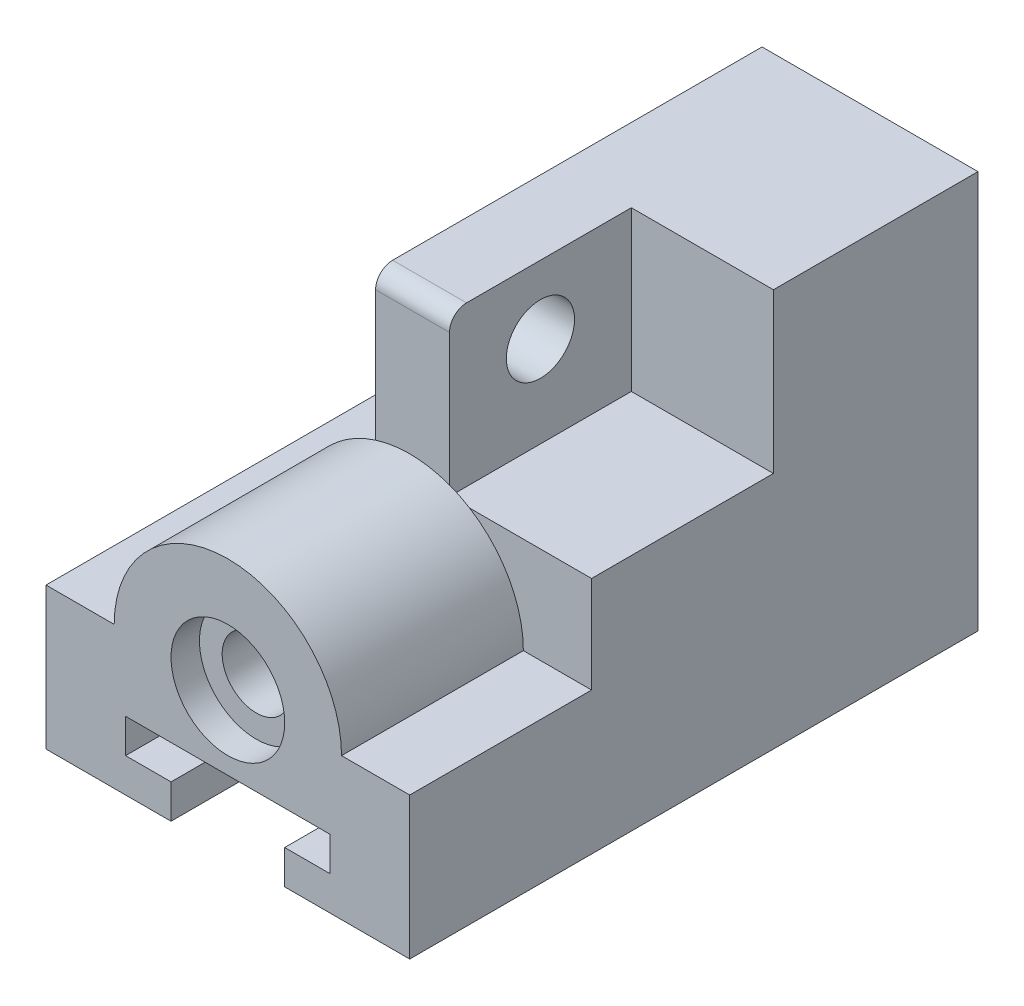
ISO-10303-21;
HEADER;
FILE_DESCRIPTION(('STEP AP214'),'2;1');
FILE_NAME('part.step','',(''),(''),'','','');
FILE_SCHEMA(('AUTOMOTIVE_DESIGN { 1 0 10303 214 1 1 1 1 }'));
ENDSEC;
DATA;
#1=APPLICATION_CONTEXT('core data for automotive mechanical design processes');
#2=APPLICATION_PROTOCOL_DEFINITION('international standard','automotive_design',2000,#1);
#3=PRODUCT_CONTEXT('',#1,'mechanical');
#4=PRODUCT('Part','Part','',(#3));
#5=PRODUCT_RELATED_PRODUCT_CATEGORY('part','',(#4));
#6=PRODUCT_DEFINITION_FORMATION('','',#4);
#7=PRODUCT_DEFINITION_CONTEXT('part definition',#1,'design');
#8=PRODUCT_DEFINITION('design','',#6,#7);
#9=PRODUCT_DEFINITION_SHAPE('','',#8);
#10=(LENGTH_UNIT() NAMED_UNIT(*) SI_UNIT(.MILLI.,.METRE.));
#11=(NAMED_UNIT(*) PLANE_ANGLE_UNIT() SI_UNIT($,.RADIAN.));
#12=(NAMED_UNIT(*) SI_UNIT($,.STERADIAN.) SOLID_ANGLE_UNIT());
#13=UNCERTAINTY_MEASURE_WITH_UNIT(LENGTH_MEASURE(1.E-05),#10,'distance_accuracy_value','');
#14=(GEOMETRIC_REPRESENTATION_CONTEXT(3) GLOBAL_UNCERTAINTY_ASSIGNED_CONTEXT((#13)) GLOBAL_UNIT_ASSIGNED_CONTEXT((#10,
#11,#12)) REPRESENTATION_CONTEXT('',''));
#15=CARTESIAN_POINT('',(0.,0.,0.));
#16=DIRECTION('',(0.,0.,1.));
#17=DIRECTION('',(1.,0.,0.));
#18=AXIS2_PLACEMENT_3D('',#15,#16,#17);
#19=CARTESIAN_POINT('',(0.,-25.,0.));
#20=DIRECTION('',(0.,-1.,0.));
#21=DIRECTION('',(0.,0.,-1.));
#22=AXIS2_PLACEMENT_3D('',#19,#20,#21);
#23=PLANE('',#22);
#24=DIRECTION('',(-1.,0.,0.));
#25=VECTOR('',#24,1.);
#26=CARTESIAN_POINT('',(0.,-25.,-100.));
#27=LINE('',#26,#25);
#28=CARTESIAN_POINT('',(22.,-25.,-100.));
#29=VERTEX_POINT('',#28);
#30=CARTESIAN_POINT('',(0.,-25.,-100.));
#31=VERTEX_POINT('',#30);
#32=EDGE_CURVE('E336',#29,#31,#27,.T.);
#33=ORIENTED_EDGE('',*,*,#32,.F.);
#34=DIRECTION('',(0.,0.,1.));
#35=VECTOR('',#34,1.);
#36=CARTESIAN_POINT('',(22.,-25.,-100.));
#37=LINE('',#36,#35);
#38=CARTESIAN_POINT('',(22.,-25.,0.));
#39=VERTEX_POINT('',#38);
#40=EDGE_CURVE('E255',#29,#39,#37,.T.);
#41=ORIENTED_EDGE('',*,*,#40,.T.);
#42=DIRECTION('',(1.,0.,0.));
#43=VECTOR('',#42,1.);
#44=CARTESIAN_POINT('',(0.,-25.,0.));
#45=LINE('',#44,#43);
#46=CARTESIAN_POINT('',(0.,-25.,0.));
#47=VERTEX_POINT('',#46);
#48=EDGE_CURVE('E330',#47,#39,#45,.T.);
#49=ORIENTED_EDGE('',*,*,#48,.F.);
#50=DIRECTION('',(0.,0.,1.));
#51=VECTOR('',#50,1.);
#52=CARTESIAN_POINT('',(0.,-25.,0.));
#53=LINE('',#52,#51);
#54=EDGE_CURVE('E325',#31,#47,#53,.T.);
#55=ORIENTED_EDGE('',*,*,#54,.F.);
#56=EDGE_LOOP('',(#33,#41,#49,#55));
#57=FACE_BOUND('',#56,.T.);
#58=ADVANCED_FACE('F41',(#57),#23,.T.);
#59=CARTESIAN_POINT('',(0.,0.,0.));
#60=DIRECTION('',(0.,-1.,0.));
#61=DIRECTION('',(0.,0.,-1.));
#62=AXIS2_PLACEMENT_3D('',#59,#60,#61);
#63=PLANE('',#62);
#64=DIRECTION('',(1.,0.,0.));
#65=VECTOR('',#64,1.);
#66=CARTESIAN_POINT('',(64.,0.,-32.));
#67=LINE('',#66,#65);
#68=CARTESIAN_POINT('',(52.,0.,-32.));
#69=VERTEX_POINT('',#68);
#70=CARTESIAN_POINT('',(64.,0.,-32.));
#71=VERTEX_POINT('',#70);
#72=EDGE_CURVE('E308',#69,#71,#67,.T.);
#73=ORIENTED_EDGE('',*,*,#72,.F.);
#74=DIRECTION('',(0.,0.,1.));
#75=VECTOR('',#74,1.);
#76=CARTESIAN_POINT('',(52.,0.,-76.7213595499958));
#77=LINE('',#76,#75);
#78=CARTESIAN_POINT('',(52.,0.,0.));
#79=VERTEX_POINT('',#78);
#80=EDGE_CURVE('E274',#69,#79,#77,.T.);
#81=ORIENTED_EDGE('',*,*,#80,.T.);
#82=DIRECTION('',(1.,0.,0.));
#83=VECTOR('',#82,1.);
#84=CARTESIAN_POINT('',(0.,0.,0.));
#85=LINE('',#84,#83);
#86=CARTESIAN_POINT('',(64.,0.,0.));
#87=VERTEX_POINT('',#86);
#88=EDGE_CURVE('E343',#79,#87,#85,.T.);
#89=ORIENTED_EDGE('',*,*,#88,.T.);
#90=DIRECTION('',(0.,0.,-1.));
#91=VECTOR('',#90,1.);
#92=CARTESIAN_POINT('',(64.,0.,0.));
#93=LINE('',#92,#91);
#94=EDGE_CURVE('E347',#87,#71,#93,.T.);
#95=ORIENTED_EDGE('',*,*,#94,.T.);
#96=EDGE_LOOP('',(#73,#81,#89,#95));
#97=FACE_BOUND('',#96,.T.);
#98=ADVANCED_FACE('F403',(#97),#63,.F.);
#99=CARTESIAN_POINT('',(64.,45.,-32.));
#100=DIRECTION('',(0.,0.,-1.));
#101=DIRECTION('',(-1.,0.,0.));
#102=AXIS2_PLACEMENT_3D('',#99,#100,#101);
#103=PLANE('',#102);
#104=DIRECTION('',(0.,-1.,0.));
#105=VECTOR('',#104,1.);
#106=CARTESIAN_POINT('',(39.,45.,-32.));
#107=LINE('',#106,#105);
#108=CARTESIAN_POINT('',(39.,42.,-32.));
#109=VERTEX_POINT('',#108);
#110=CARTESIAN_POINT('',(39.,18.7349939951952,-32.));
#111=VERTEX_POINT('',#110);
#112=EDGE_CURVE('E281',#109,#111,#107,.T.);
#113=ORIENTED_EDGE('',*,*,#112,.F.);
#114=DIRECTION('',(1.,0.,0.));
#115=VECTOR('',#114,1.);
#116=CARTESIAN_POINT('',(64.,42.,-32.));
#117=LINE('',#116,#115);
#118=CARTESIAN_POINT('',(26.,42.,-32.));
#119=VERTEX_POINT('',#118);
#120=EDGE_CURVE('E49',#109,#119,#117,.F.);
#121=ORIENTED_EDGE('',*,*,#120,.T.);
#122=DIRECTION('',(0.,-1.,0.));
#123=VECTOR('',#122,1.);
#124=CARTESIAN_POINT('',(26.,45.,-32.));
#125=LINE('',#124,#123);
#126=CARTESIAN_POINT('',(26.,19.0787840283389,-32.));
#127=VERTEX_POINT('',#126);
#128=EDGE_CURVE('E319',#119,#127,#125,.T.);
#129=ORIENTED_EDGE('',*,*,#128,.T.);
#130=CARTESIAN_POINT('',(32.,0.,-32.));
#131=DIRECTION('',(0.,0.,-1.));
#132=DIRECTION('',(-1.,0.,0.));
#133=AXIS2_PLACEMENT_3D('',#130,#131,#132);
#134=CIRCLE('',#133,20.);
#135=EDGE_CURVE('E462',#111,#127,#134,.F.);
#136=ORIENTED_EDGE('',*,*,#135,.F.);
#137=EDGE_LOOP('',(#113,#121,#129,#136));
#138=FACE_BOUND('',#137,.T.);
#139=ADVANCED_FACE('F410',(#138),#103,.F.);
#140=DIRECTION('',(0.,0.,1.));
#141=VECTOR('',#140,1.);
#142=CARTESIAN_POINT('',(12.,0.,-76.7213595499958));
#143=LINE('',#142,#141);
#144=CARTESIAN_POINT('',(12.,0.,-32.));
#145=VERTEX_POINT('',#144);
#146=CARTESIAN_POINT('',(12.,0.,0.));
#147=VERTEX_POINT('',#146);
#148=EDGE_CURVE('E270',#145,#147,#143,.T.);
#149=ORIENTED_EDGE('',*,*,#148,.F.);
#150=DIRECTION('',(-1.,0.,0.));
#151=VECTOR('',#150,1.);
#152=CARTESIAN_POINT('',(0.,0.,-32.));
#153=LINE('',#152,#151);
#154=CARTESIAN_POINT('',(26.,0.,-32.));
#155=VERTEX_POINT('',#154);
#156=EDGE_CURVE('E250',#155,#145,#153,.T.);
#157=ORIENTED_EDGE('',*,*,#156,.F.);
#158=DIRECTION('',(0.,0.,1.));
#159=VECTOR('',#158,1.);
#160=CARTESIAN_POINT('',(26.,0.,-100.));
#161=LINE('',#160,#159);
#162=CARTESIAN_POINT('',(26.,0.,-100.));
#163=VERTEX_POINT('',#162);
#164=EDGE_CURVE('E299',#163,#155,#161,.T.);
#165=ORIENTED_EDGE('',*,*,#164,.F.);
#166=DIRECTION('',(-1.,0.,0.));
#167=VECTOR('',#166,1.);
#168=CARTESIAN_POINT('',(0.,0.,-100.));
#169=LINE('',#168,#167);
#170=CARTESIAN_POINT('',(0.,0.,-100.));
#171=VERTEX_POINT('',#170);
#172=EDGE_CURVE('E329',#163,#171,#169,.T.);
#173=ORIENTED_EDGE('',*,*,#172,.T.);
#174=DIRECTION('',(0.,0.,1.));
#175=VECTOR('',#174,1.);
#176=CARTESIAN_POINT('',(0.,0.,0.));
#177=LINE('',#176,#175);
#178=CARTESIAN_POINT('',(0.,0.,0.));
#179=VERTEX_POINT('',#178);
#180=EDGE_CURVE('E324',#171,#179,#177,.T.);
#181=ORIENTED_EDGE('',*,*,#180,.T.);
#182=EDGE_CURVE('E344',#179,#147,#85,.T.);
#183=ORIENTED_EDGE('',*,*,#182,.T.);
#184=EDGE_LOOP('',(#149,#157,#165,#173,#181,#183));
#185=FACE_BOUND('',#184,.T.);
#186=ADVANCED_FACE('F413',(#185),#63,.F.);
#187=CARTESIAN_POINT('',(0.,-25.,0.));
#188=DIRECTION('',(-1.,0.,0.));
#189=DIRECTION('',(0.,0.,1.));
#190=AXIS2_PLACEMENT_3D('',#187,#188,#189);
#191=PLANE('',#190);
#192=ORIENTED_EDGE('',*,*,#180,.F.);
#193=DIRECTION('',(0.,1.,0.));
#194=VECTOR('',#193,1.);
#195=CARTESIAN_POINT('',(0.,-25.,-100.));
#196=LINE('',#195,#194);
#197=EDGE_CURVE('E351',#31,#171,#196,.T.);
#198=ORIENTED_EDGE('',*,*,#197,.F.);
#199=ORIENTED_EDGE('',*,*,#54,.T.);
#200=DIRECTION('',(0.,1.,0.));
#201=VECTOR('',#200,1.);
#202=CARTESIAN_POINT('',(0.,-25.,0.));
#203=LINE('',#202,#201);
#204=EDGE_CURVE('E340',#47,#179,#203,.T.);
#205=ORIENTED_EDGE('',*,*,#204,.T.);
#206=EDGE_LOOP('',(#192,#198,#199,#205));
#207=FACE_BOUND('',#206,.T.);
#208=ADVANCED_FACE('F451',(#207),#191,.T.);
#209=CARTESIAN_POINT('',(0.,-25.,-100.));
#210=DIRECTION('',(0.,0.,-1.));
#211=DIRECTION('',(-1.,0.,0.));
#212=AXIS2_PLACEMENT_3D('',#209,#210,#211);
#213=PLANE('',#212);
#214=DIRECTION('',(0.,1.,0.));
#215=VECTOR('',#214,1.);
#216=CARTESIAN_POINT('',(42.,0.,-100.));
#217=LINE('',#216,#215);
#218=CARTESIAN_POINT('',(42.,-25.,-100.));
#219=VERTEX_POINT('',#218);
#220=CARTESIAN_POINT('',(42.,-19.,-100.));
#221=VERTEX_POINT('',#220);
#222=EDGE_CURVE('E231',#219,#221,#217,.T.);
#223=ORIENTED_EDGE('',*,*,#222,.T.);
#224=DIRECTION('',(1.,0.,0.));
#225=VECTOR('',#224,1.);
#226=CARTESIAN_POINT('',(0.,-19.,-100.));
#227=LINE('',#226,#225);
#228=CARTESIAN_POINT('',(50.,-19.,-100.));
#229=VERTEX_POINT('',#228);
#230=EDGE_CURVE('E210',#221,#229,#227,.T.);
#231=ORIENTED_EDGE('',*,*,#230,.T.);
#232=DIRECTION('',(0.,-1.,0.));
#233=VECTOR('',#232,1.);
#234=CARTESIAN_POINT('',(50.,0.,-100.));
#235=LINE('',#234,#233);
#236=CARTESIAN_POINT('',(50.,-13.,-100.));
#237=VERTEX_POINT('',#236);
#238=EDGE_CURVE('E202',#237,#229,#235,.T.);
#239=ORIENTED_EDGE('',*,*,#238,.F.);
#240=DIRECTION('',(1.,0.,0.));
#241=VECTOR('',#240,1.);
#242=CARTESIAN_POINT('',(0.,-13.,-100.));
#243=LINE('',#242,#241);
#244=CARTESIAN_POINT('',(14.,-13.,-100.));
#245=VERTEX_POINT('',#244);
#246=EDGE_CURVE('E190',#245,#237,#243,.T.);
#247=ORIENTED_EDGE('',*,*,#246,.F.);
#248=DIRECTION('',(0.,-1.,0.));
#249=VECTOR('',#248,1.);
#250=CARTESIAN_POINT('',(14.,0.,-100.));
#251=LINE('',#250,#249);
#252=CARTESIAN_POINT('',(14.,-19.,-100.));
#253=VERTEX_POINT('',#252);
#254=EDGE_CURVE('E201',#245,#253,#251,.T.);
#255=ORIENTED_EDGE('',*,*,#254,.T.);
#256=DIRECTION('',(1.,0.,0.));
#257=VECTOR('',#256,1.);
#258=CARTESIAN_POINT('',(0.,-19.,-100.));
#259=LINE('',#258,#257);
#260=CARTESIAN_POINT('',(22.,-19.,-100.));
#261=VERTEX_POINT('',#260);
#262=EDGE_CURVE('E226',#253,#261,#259,.T.);
#263=ORIENTED_EDGE('',*,*,#262,.T.);
#264=DIRECTION('',(0.,1.,0.));
#265=VECTOR('',#264,1.);
#266=CARTESIAN_POINT('',(22.,0.,-100.));
#267=LINE('',#266,#265);
#268=EDGE_CURVE('E229',#29,#261,#267,.T.);
#269=ORIENTED_EDGE('',*,*,#268,.F.);
#270=ORIENTED_EDGE('',*,*,#32,.T.);
#271=ORIENTED_EDGE('',*,*,#197,.T.);
#272=ORIENTED_EDGE('',*,*,#172,.F.);
#273=DIRECTION('',(0.,-1.,0.));
#274=VECTOR('',#273,1.);
#275=CARTESIAN_POINT('',(26.,45.,-100.));
#276=LINE('',#275,#274);
#277=CARTESIAN_POINT('',(26.,45.,-100.));
#278=VERTEX_POINT('',#277);
#279=EDGE_CURVE('E321',#278,#163,#276,.T.);
#280=ORIENTED_EDGE('',*,*,#279,.F.);
#281=DIRECTION('',(-1.,0.,0.));
#282=VECTOR('',#281,1.);
#283=CARTESIAN_POINT('',(64.,45.,-100.));
#284=LINE('',#283,#282);
#285=CARTESIAN_POINT('',(64.,45.,-100.));
#286=VERTEX_POINT('',#285);
#287=EDGE_CURVE('E307',#286,#278,#284,.T.);
#288=ORIENTED_EDGE('',*,*,#287,.F.);
#289=DIRECTION('',(0.,1.,0.));
#290=VECTOR('',#289,1.);
#291=CARTESIAN_POINT('',(64.,-25.,-100.));
#292=LINE('',#291,#290);
#293=CARTESIAN_POINT('',(64.,-25.,-100.));
#294=VERTEX_POINT('',#293);
#295=EDGE_CURVE('E355',#294,#286,#292,.T.);
#296=ORIENTED_EDGE('',*,*,#295,.F.);
#297=EDGE_CURVE('E337',#294,#219,#27,.T.);
#298=ORIENTED_EDGE('',*,*,#297,.T.);
#299=EDGE_LOOP('',(#223,#231,#239,#247,#255,#263,#269,#270,#271,#272,#280,#288,#296,#298));
#300=FACE_BOUND('',#299,.T.);
#301=ADVANCED_FACE('F214',(#300),#213,.T.);
#302=CARTESIAN_POINT('',(64.,-25.,0.));
#303=DIRECTION('',(1.,0.,0.));
#304=DIRECTION('',(0.,0.,-1.));
#305=AXIS2_PLACEMENT_3D('',#302,#303,#304);
#306=PLANE('',#305);
#307=DIRECTION('',(0.,1.,0.));
#308=VECTOR('',#307,1.);
#309=CARTESIAN_POINT('',(64.,45.,-64.));
#310=LINE('',#309,#308);
#311=CARTESIAN_POINT('',(64.,17.,-64.));
#312=VERTEX_POINT('',#311);
#313=CARTESIAN_POINT('',(64.,45.,-64.));
#314=VERTEX_POINT('',#313);
#315=EDGE_CURVE('E294',#312,#314,#310,.T.);
#316=ORIENTED_EDGE('',*,*,#315,.F.);
#317=DIRECTION('',(0.,0.,-1.));
#318=VECTOR('',#317,1.);
#319=CARTESIAN_POINT('',(64.,17.,-32.));
#320=LINE('',#319,#318);
#321=CARTESIAN_POINT('',(64.,17.,-32.));
#322=VERTEX_POINT('',#321);
#323=EDGE_CURVE('E280',#322,#312,#320,.T.);
#324=ORIENTED_EDGE('',*,*,#323,.F.);
#325=DIRECTION('',(0.,-1.,0.));
#326=VECTOR('',#325,1.);
#327=CARTESIAN_POINT('',(64.,45.,-32.));
#328=LINE('',#327,#326);
#329=EDGE_CURVE('E313',#322,#71,#328,.T.);
#330=ORIENTED_EDGE('',*,*,#329,.T.);
#331=ORIENTED_EDGE('',*,*,#94,.F.);
#332=DIRECTION('',(0.,1.,0.));
#333=VECTOR('',#332,1.);
#334=CARTESIAN_POINT('',(64.,-25.,0.));
#335=LINE('',#334,#333);
#336=CARTESIAN_POINT('',(64.,-25.,0.));
#337=VERTEX_POINT('',#336);
#338=EDGE_CURVE('E358',#337,#87,#335,.T.);
#339=ORIENTED_EDGE('',*,*,#338,.F.);
#340=DIRECTION('',(0.,0.,-1.));
#341=VECTOR('',#340,1.);
#342=CARTESIAN_POINT('',(64.,-25.,0.));
#343=LINE('',#342,#341);
#344=EDGE_CURVE('E333',#337,#294,#343,.T.);
#345=ORIENTED_EDGE('',*,*,#344,.T.);
#346=ORIENTED_EDGE('',*,*,#295,.T.);
#347=DIRECTION('',(0.,0.,-1.));
#348=VECTOR('',#347,1.);
#349=CARTESIAN_POINT('',(64.,45.,-100.));
#350=LINE('',#349,#348);
#351=EDGE_CURVE('E305',#314,#286,#350,.T.);
#352=ORIENTED_EDGE('',*,*,#351,.F.);
#353=EDGE_LOOP('',(#316,#324,#330,#331,#339,#345,#346,#352));
#354=FACE_BOUND('',#353,.T.);
#355=ADVANCED_FACE('F381',(#354),#306,.T.);
#356=CARTESIAN_POINT('',(0.,-25.,0.));
#357=DIRECTION('',(0.,0.,1.));
#358=DIRECTION('',(1.,0.,0.));
#359=AXIS2_PLACEMENT_3D('',#356,#357,#358);
#360=PLANE('',#359);
#361=CARTESIAN_POINT('',(32.,0.,0.));
#362=DIRECTION('',(0.,0.,1.));
#363=DIRECTION('',(1.,0.,0.));
#364=AXIS2_PLACEMENT_3D('',#361,#362,#363);
#365=CIRCLE('',#364,9.99999999999999);
#366=CARTESIAN_POINT('',(42.,0.,0.));
#367=VERTEX_POINT('',#366);
#368=EDGE_CURVE('E726',#367,#367,#365,.T.);
#369=ORIENTED_EDGE('',*,*,#368,.F.);
#370=EDGE_LOOP('',(#369));
#371=FACE_BOUND('',#370,.T.);
#372=DIRECTION('',(0.,1.,0.));
#373=VECTOR('',#372,1.);
#374=CARTESIAN_POINT('',(42.,0.,0.));
#375=LINE('',#374,#373);
#376=CARTESIAN_POINT('',(42.,-25.,0.));
#377=VERTEX_POINT('',#376);
#378=CARTESIAN_POINT('',(42.,-19.,0.));
#379=VERTEX_POINT('',#378);
#380=EDGE_CURVE('E219',#377,#379,#375,.T.);
#381=ORIENTED_EDGE('',*,*,#380,.F.);
#382=EDGE_CURVE('E328',#377,#337,#45,.T.);
#383=ORIENTED_EDGE('',*,*,#382,.T.);
#384=ORIENTED_EDGE('',*,*,#338,.T.);
#385=ORIENTED_EDGE('',*,*,#88,.F.);
#386=CARTESIAN_POINT('',(32.,0.,0.));
#387=DIRECTION('',(0.,0.,1.));
#388=DIRECTION('',(1.,0.,0.));
#389=AXIS2_PLACEMENT_3D('',#386,#387,#388);
#390=CIRCLE('',#389,20.);
#391=EDGE_CURVE('E263',#79,#147,#390,.T.);
#392=ORIENTED_EDGE('',*,*,#391,.T.);
#393=ORIENTED_EDGE('',*,*,#182,.F.);
#394=ORIENTED_EDGE('',*,*,#204,.F.);
#395=ORIENTED_EDGE('',*,*,#48,.T.);
#396=DIRECTION('',(0.,1.,0.));
#397=VECTOR('',#396,1.);
#398=CARTESIAN_POINT('',(22.,0.,0.));
#399=LINE('',#398,#397);
#400=CARTESIAN_POINT('',(22.,-19.,0.));
#401=VERTEX_POINT('',#400);
#402=EDGE_CURVE('E243',#39,#401,#399,.T.);
#403=ORIENTED_EDGE('',*,*,#402,.T.);
#404=DIRECTION('',(1.,0.,0.));
#405=VECTOR('',#404,1.);
#406=CARTESIAN_POINT('',(0.,-19.,0.));
#407=LINE('',#406,#405);
#408=CARTESIAN_POINT('',(14.,-19.,0.));
#409=VERTEX_POINT('',#408);
#410=EDGE_CURVE('E240',#409,#401,#407,.T.);
#411=ORIENTED_EDGE('',*,*,#410,.F.);
#412=DIRECTION('',(0.,-1.,0.));
#413=VECTOR('',#412,1.);
#414=CARTESIAN_POINT('',(14.,0.,0.));
#415=LINE('',#414,#413);
#416=CARTESIAN_POINT('',(14.,-13.,0.));
#417=VERTEX_POINT('',#416);
#418=EDGE_CURVE('E237',#417,#409,#415,.T.);
#419=ORIENTED_EDGE('',*,*,#418,.F.);
#420=DIRECTION('',(1.,0.,0.));
#421=VECTOR('',#420,1.);
#422=CARTESIAN_POINT('',(0.,-13.,0.));
#423=LINE('',#422,#421);
#424=CARTESIAN_POINT('',(50.,-13.,0.));
#425=VERTEX_POINT('',#424);
#426=EDGE_CURVE('E235',#417,#425,#423,.T.);
#427=ORIENTED_EDGE('',*,*,#426,.T.);
#428=DIRECTION('',(0.,-1.,0.));
#429=VECTOR('',#428,1.);
#430=CARTESIAN_POINT('',(50.,0.,0.));
#431=LINE('',#430,#429);
#432=CARTESIAN_POINT('',(50.,-19.,0.));
#433=VERTEX_POINT('',#432);
#434=EDGE_CURVE('E208',#425,#433,#431,.T.);
#435=ORIENTED_EDGE('',*,*,#434,.T.);
#436=DIRECTION('',(1.,0.,0.));
#437=VECTOR('',#436,1.);
#438=CARTESIAN_POINT('',(0.,-19.,0.));
#439=LINE('',#438,#437);
#440=EDGE_CURVE('E216',#379,#433,#439,.T.);
#441=ORIENTED_EDGE('',*,*,#440,.F.);
#442=EDGE_LOOP('',(#381,#383,#384,#385,#392,#393,#394,#395,#403,#411,#419,#427,#435,#441));
#443=FACE_BOUND('',#442,.T.);
#444=ADVANCED_FACE('F417',(#371,#443),#360,.T.);
#445=DIRECTION('',(0.,0.,1.));
#446=VECTOR('',#445,1.);
#447=CARTESIAN_POINT('',(42.,-25.,-100.));
#448=LINE('',#447,#446);
#449=EDGE_CURVE('E253',#219,#377,#448,.T.);
#450=ORIENTED_EDGE('',*,*,#449,.F.);
#451=ORIENTED_EDGE('',*,*,#297,.F.);
#452=ORIENTED_EDGE('',*,*,#344,.F.);
#453=ORIENTED_EDGE('',*,*,#382,.F.);
#454=EDGE_LOOP('',(#450,#451,#452,#453));
#455=FACE_BOUND('',#454,.T.);
#456=ADVANCED_FACE('F406',(#455),#23,.T.);
#457=CARTESIAN_POINT('',(26.,45.,-100.));
#458=DIRECTION('',(1.,0.,0.));
#459=DIRECTION('',(0.,0.,-1.));
#460=AXIS2_PLACEMENT_3D('',#457,#458,#459);
#461=PLANE('',#460);
#462=CARTESIAN_POINT('',(26.,33.,-48.));
#463=DIRECTION('',(1.,0.,0.));
#464=DIRECTION('',(0.,0.,-1.));
#465=AXIS2_PLACEMENT_3D('',#462,#463,#464);
#466=CIRCLE('',#465,6.);
#467=CARTESIAN_POINT('',(26.,33.,-54.));
#468=VERTEX_POINT('',#467);
#469=EDGE_CURVE('E725',#468,#468,#466,.T.);
#470=ORIENTED_EDGE('',*,*,#469,.T.);
#471=EDGE_LOOP('',(#470));
#472=FACE_BOUND('',#471,.T.);
#473=ORIENTED_EDGE('',*,*,#128,.F.);
#474=CARTESIAN_POINT('',(26.,42.,-35.));
#475=DIRECTION('',(1.,0.,0.));
#476=DIRECTION('',(0.,0.,-1.));
#477=AXIS2_PLACEMENT_3D('',#474,#475,#476);
#478=CIRCLE('',#477,3.);
#479=CARTESIAN_POINT('',(26.,45.,-35.));
#480=VERTEX_POINT('',#479);
#481=EDGE_CURVE('E11',#119,#480,#478,.F.);
#482=ORIENTED_EDGE('',*,*,#481,.T.);
#483=DIRECTION('',(0.,0.,1.));
#484=VECTOR('',#483,1.);
#485=CARTESIAN_POINT('',(26.,45.,-100.));
#486=LINE('',#485,#484);
#487=EDGE_CURVE('E310',#278,#480,#486,.T.);
#488=ORIENTED_EDGE('',*,*,#487,.F.);
#489=ORIENTED_EDGE('',*,*,#279,.T.);
#490=ORIENTED_EDGE('',*,*,#164,.T.);
#491=DIRECTION('',(0.,1.,0.));
#492=VECTOR('',#491,1.);
#493=CARTESIAN_POINT('',(26.,45.,-32.));
#494=LINE('',#493,#492);
#495=EDGE_CURVE('E277',#155,#127,#494,.T.);
#496=ORIENTED_EDGE('',*,*,#495,.T.);
#497=EDGE_LOOP('',(#473,#482,#488,#489,#490,#496));
#498=FACE_BOUND('',#497,.T.);
#499=ADVANCED_FACE('F390',(#472,#498),#461,.F.);
#500=DIRECTION('',(1.,0.,0.));
#501=VECTOR('',#500,1.);
#502=CARTESIAN_POINT('',(39.,17.,-32.));
#503=LINE('',#502,#501);
#504=CARTESIAN_POINT('',(42.5356537528528,17.,-32.));
#505=VERTEX_POINT('',#504);
#506=EDGE_CURVE('E291',#505,#322,#503,.T.);
#507=ORIENTED_EDGE('',*,*,#506,.F.);
#508=EDGE_CURVE('E267',#69,#505,#134,.F.);
#509=ORIENTED_EDGE('',*,*,#508,.F.);
#510=ORIENTED_EDGE('',*,*,#72,.T.);
#511=ORIENTED_EDGE('',*,*,#329,.F.);
#512=EDGE_LOOP('',(#507,#509,#510,#511));
#513=FACE_BOUND('',#512,.T.);
#514=ADVANCED_FACE('F423',(#513),#103,.F.);
#515=CARTESIAN_POINT('',(0.,45.,0.));
#516=DIRECTION('',(0.,-1.,0.));
#517=DIRECTION('',(0.,0.,-1.));
#518=AXIS2_PLACEMENT_3D('',#515,#516,#517);
#519=PLANE('',#518);
#520=ORIENTED_EDGE('',*,*,#487,.T.);
#521=DIRECTION('',(1.,0.,0.));
#522=VECTOR('',#521,1.);
#523=CARTESIAN_POINT('',(0.,45.,-35.));
#524=LINE('',#523,#522);
#525=CARTESIAN_POINT('',(39.,45.,-35.));
#526=VERTEX_POINT('',#525);
#527=EDGE_CURVE('E354',#480,#526,#524,.T.);
#528=ORIENTED_EDGE('',*,*,#527,.T.);
#529=DIRECTION('',(0.,0.,1.));
#530=VECTOR('',#529,1.);
#531=CARTESIAN_POINT('',(39.,45.,-32.));
#532=LINE('',#531,#530);
#533=CARTESIAN_POINT('',(39.,45.,-64.));
#534=VERTEX_POINT('',#533);
#535=EDGE_CURVE('E289',#534,#526,#532,.T.);
#536=ORIENTED_EDGE('',*,*,#535,.F.);
#537=DIRECTION('',(1.,0.,0.));
#538=VECTOR('',#537,1.);
#539=CARTESIAN_POINT('',(39.,45.,-64.));
#540=LINE('',#539,#538);
#541=EDGE_CURVE('E296',#534,#314,#540,.T.);
#542=ORIENTED_EDGE('',*,*,#541,.T.);
#543=ORIENTED_EDGE('',*,*,#351,.T.);
#544=ORIENTED_EDGE('',*,*,#287,.T.);
#545=EDGE_LOOP('',(#520,#528,#536,#542,#543,#544));
#546=FACE_BOUND('',#545,.T.);
#547=ADVANCED_FACE('F367',(#546),#519,.F.);
#548=CARTESIAN_POINT('',(39.,45.,-64.));
#549=DIRECTION('',(0.,0.,-1.));
#550=DIRECTION('',(-1.,0.,0.));
#551=AXIS2_PLACEMENT_3D('',#548,#549,#550);
#552=PLANE('',#551);
#553=ORIENTED_EDGE('',*,*,#315,.T.);
#554=ORIENTED_EDGE('',*,*,#541,.F.);
#555=DIRECTION('',(0.,1.,0.));
#556=VECTOR('',#555,1.);
#557=CARTESIAN_POINT('',(39.,45.,-64.));
#558=LINE('',#557,#556);
#559=CARTESIAN_POINT('',(39.,17.,-64.));
#560=VERTEX_POINT('',#559);
#561=EDGE_CURVE('E287',#560,#534,#558,.T.);
#562=ORIENTED_EDGE('',*,*,#561,.F.);
#563=DIRECTION('',(1.,0.,0.));
#564=VECTOR('',#563,1.);
#565=CARTESIAN_POINT('',(39.,17.,-64.));
#566=LINE('',#565,#564);
#567=EDGE_CURVE('E300',#560,#312,#566,.T.);
#568=ORIENTED_EDGE('',*,*,#567,.T.);
#569=EDGE_LOOP('',(#553,#554,#562,#568));
#570=FACE_BOUND('',#569,.T.);
#571=ADVANCED_FACE('F377',(#570),#552,.F.);
#572=CARTESIAN_POINT('',(39.,17.,-32.));
#573=DIRECTION('',(0.,-1.,0.));
#574=DIRECTION('',(0.,0.,-1.));
#575=AXIS2_PLACEMENT_3D('',#572,#573,#574);
#576=PLANE('',#575);
#577=ORIENTED_EDGE('',*,*,#323,.T.);
#578=ORIENTED_EDGE('',*,*,#567,.F.);
#579=DIRECTION('',(0.,0.,-1.));
#580=VECTOR('',#579,1.);
#581=CARTESIAN_POINT('',(39.,17.,-32.));
#582=LINE('',#581,#580);
#583=CARTESIAN_POINT('',(39.,17.,-32.));
#584=VERTEX_POINT('',#583);
#585=EDGE_CURVE('E283',#584,#560,#582,.T.);
#586=ORIENTED_EDGE('',*,*,#585,.F.);
#587=EDGE_CURVE('E302',#584,#505,#503,.T.);
#588=ORIENTED_EDGE('',*,*,#587,.T.);
#589=ORIENTED_EDGE('',*,*,#506,.T.);
#590=EDGE_LOOP('',(#577,#578,#586,#588,#589));
#591=FACE_BOUND('',#590,.T.);
#592=ADVANCED_FACE('F470',(#591),#576,.F.);
#593=CARTESIAN_POINT('',(39.,0.,0.));
#594=DIRECTION('',(1.,0.,0.));
#595=DIRECTION('',(0.,0.,-1.));
#596=AXIS2_PLACEMENT_3D('',#593,#594,#595);
#597=PLANE('',#596);
#598=CARTESIAN_POINT('',(39.,33.,-48.));
#599=DIRECTION('',(1.,0.,0.));
#600=DIRECTION('',(0.,0.,-1.));
#601=AXIS2_PLACEMENT_3D('',#598,#599,#600);
#602=CIRCLE('',#601,6.);
#603=CARTESIAN_POINT('',(39.,33.,-54.));
#604=VERTEX_POINT('',#603);
#605=EDGE_CURVE('E722',#604,#604,#602,.T.);
#606=ORIENTED_EDGE('',*,*,#605,.F.);
#607=EDGE_LOOP('',(#606));
#608=FACE_BOUND('',#607,.T.);
#609=ORIENTED_EDGE('',*,*,#535,.T.);
#610=CARTESIAN_POINT('',(39.,42.,-35.));
#611=DIRECTION('',(1.,0.,0.));
#612=DIRECTION('',(0.,0.,-1.));
#613=AXIS2_PLACEMENT_3D('',#610,#611,#612);
#614=CIRCLE('',#613,3.);
#615=EDGE_CURVE('E63',#526,#109,#614,.T.);
#616=ORIENTED_EDGE('',*,*,#615,.T.);
#617=ORIENTED_EDGE('',*,*,#112,.T.);
#618=EDGE_CURVE('E284',#111,#584,#107,.T.);
#619=ORIENTED_EDGE('',*,*,#618,.T.);
#620=ORIENTED_EDGE('',*,*,#585,.T.);
#621=ORIENTED_EDGE('',*,*,#561,.T.);
#622=EDGE_LOOP('',(#609,#616,#617,#619,#620,#621));
#623=FACE_BOUND('',#622,.T.);
#624=ADVANCED_FACE('F371',(#608,#623),#597,.T.);
#625=CARTESIAN_POINT('',(64.,45.,-32.));
#626=DIRECTION('',(0.,0.,-1.));
#627=DIRECTION('',(-1.,0.,0.));
#628=AXIS2_PLACEMENT_3D('',#625,#626,#627);
#629=PLANE('',#628);
#630=ORIENTED_EDGE('',*,*,#495,.F.);
#631=ORIENTED_EDGE('',*,*,#156,.T.);
#632=EDGE_CURVE('E266',#127,#145,#134,.F.);
#633=ORIENTED_EDGE('',*,*,#632,.F.);
#634=EDGE_LOOP('',(#630,#631,#633));
#635=FACE_BOUND('',#634,.T.);
#636=ADVANCED_FACE('F458',(#635),#629,.T.);
#637=ORIENTED_EDGE('',*,*,#587,.F.);
#638=ORIENTED_EDGE('',*,*,#618,.F.);
#639=EDGE_CURVE('E271',#505,#111,#134,.F.);
#640=ORIENTED_EDGE('',*,*,#639,.F.);
#641=EDGE_LOOP('',(#637,#638,#640));
#642=FACE_BOUND('',#641,.T.);
#643=ADVANCED_FACE('F468',(#642),#629,.T.);
#644=CARTESIAN_POINT('',(32.,0.,-76.7213595499958));
#645=DIRECTION('',(0.,0.,1.));
#646=DIRECTION('',(1.,0.,0.));
#647=AXIS2_PLACEMENT_3D('',#644,#645,#646);
#648=CYLINDRICAL_SURFACE('',#647,20.);
#649=ORIENTED_EDGE('',*,*,#80,.F.);
#650=ORIENTED_EDGE('',*,*,#508,.T.);
#651=ORIENTED_EDGE('',*,*,#639,.T.);
#652=ORIENTED_EDGE('',*,*,#135,.T.);
#653=ORIENTED_EDGE('',*,*,#632,.T.);
#654=ORIENTED_EDGE('',*,*,#148,.T.);
#655=ORIENTED_EDGE('',*,*,#391,.F.);
#656=EDGE_LOOP('',(#649,#650,#651,#652,#653,#654,#655));
#657=FACE_BOUND('',#656,.T.);
#658=ADVANCED_FACE('F465',(#657),#648,.T.);
#659=CARTESIAN_POINT('',(50.,0.,-100.));
#660=DIRECTION('',(-1.,0.,0.));
#661=DIRECTION('',(0.,0.,1.));
#662=AXIS2_PLACEMENT_3D('',#659,#660,#661);
#663=PLANE('',#662);
#664=ORIENTED_EDGE('',*,*,#434,.F.);
#665=DIRECTION('',(0.,0.,1.));
#666=VECTOR('',#665,1.);
#667=CARTESIAN_POINT('',(50.,-13.,-100.));
#668=LINE('',#667,#666);
#669=EDGE_CURVE('E194',#237,#425,#668,.T.);
#670=ORIENTED_EDGE('',*,*,#669,.F.);
#671=ORIENTED_EDGE('',*,*,#238,.T.);
#672=DIRECTION('',(0.,0.,1.));
#673=VECTOR('',#672,1.);
#674=CARTESIAN_POINT('',(50.,-19.,-100.));
#675=LINE('',#674,#673);
#676=EDGE_CURVE('E248',#229,#433,#675,.T.);
#677=ORIENTED_EDGE('',*,*,#676,.T.);
#678=EDGE_LOOP('',(#664,#670,#671,#677));
#679=FACE_BOUND('',#678,.T.);
#680=ADVANCED_FACE('F205',(#679),#663,.T.);
#681=CARTESIAN_POINT('',(0.,-19.,-100.));
#682=DIRECTION('',(0.,-1.,0.));
#683=DIRECTION('',(0.,0.,-1.));
#684=AXIS2_PLACEMENT_3D('',#681,#682,#683);
#685=PLANE('',#684);
#686=ORIENTED_EDGE('',*,*,#440,.T.);
#687=ORIENTED_EDGE('',*,*,#676,.F.);
#688=ORIENTED_EDGE('',*,*,#230,.F.);
#689=DIRECTION('',(0.,0.,1.));
#690=VECTOR('',#689,1.);
#691=CARTESIAN_POINT('',(42.,-19.,-100.));
#692=LINE('',#691,#690);
#693=EDGE_CURVE('E251',#221,#379,#692,.T.);
#694=ORIENTED_EDGE('',*,*,#693,.T.);
#695=EDGE_LOOP('',(#686,#687,#688,#694));
#696=FACE_BOUND('',#695,.T.);
#697=ADVANCED_FACE('F434',(#696),#685,.F.);
#698=CARTESIAN_POINT('',(42.,0.,-100.));
#699=DIRECTION('',(1.,0.,0.));
#700=DIRECTION('',(0.,0.,-1.));
#701=AXIS2_PLACEMENT_3D('',#698,#699,#700);
#702=PLANE('',#701);
#703=ORIENTED_EDGE('',*,*,#380,.T.);
#704=ORIENTED_EDGE('',*,*,#693,.F.);
#705=ORIENTED_EDGE('',*,*,#222,.F.);
#706=ORIENTED_EDGE('',*,*,#449,.T.);
#707=EDGE_LOOP('',(#703,#704,#705,#706));
#708=FACE_BOUND('',#707,.T.);
#709=ADVANCED_FACE('F431',(#708),#702,.F.);
#710=CARTESIAN_POINT('',(22.,0.,-100.));
#711=DIRECTION('',(1.,0.,0.));
#712=DIRECTION('',(0.,0.,-1.));
#713=AXIS2_PLACEMENT_3D('',#710,#711,#712);
#714=PLANE('',#713);
#715=ORIENTED_EDGE('',*,*,#402,.F.);
#716=ORIENTED_EDGE('',*,*,#40,.F.);
#717=ORIENTED_EDGE('',*,*,#268,.T.);
#718=DIRECTION('',(0.,0.,1.));
#719=VECTOR('',#718,1.);
#720=CARTESIAN_POINT('',(22.,-19.,-100.));
#721=LINE('',#720,#719);
#722=EDGE_CURVE('E258',#261,#401,#721,.T.);
#723=ORIENTED_EDGE('',*,*,#722,.T.);
#724=EDGE_LOOP('',(#715,#716,#717,#723));
#725=FACE_BOUND('',#724,.T.);
#726=ADVANCED_FACE('F445',(#725),#714,.T.);
#727=CARTESIAN_POINT('',(0.,-19.,-100.));
#728=DIRECTION('',(0.,-1.,0.));
#729=DIRECTION('',(0.,0.,-1.));
#730=AXIS2_PLACEMENT_3D('',#727,#728,#729);
#731=PLANE('',#730);
#732=ORIENTED_EDGE('',*,*,#410,.T.);
#733=ORIENTED_EDGE('',*,*,#722,.F.);
#734=ORIENTED_EDGE('',*,*,#262,.F.);
#735=DIRECTION('',(0.,0.,1.));
#736=VECTOR('',#735,1.);
#737=CARTESIAN_POINT('',(14.,-19.,-100.));
#738=LINE('',#737,#736);
#739=EDGE_CURVE('E260',#253,#409,#738,.T.);
#740=ORIENTED_EDGE('',*,*,#739,.T.);
#741=EDGE_LOOP('',(#732,#733,#734,#740));
#742=FACE_BOUND('',#741,.T.);
#743=ADVANCED_FACE('F443',(#742),#731,.F.);
#744=CARTESIAN_POINT('',(14.,0.,-100.));
#745=DIRECTION('',(-1.,0.,0.));
#746=DIRECTION('',(0.,-1.,0.));
#747=AXIS2_PLACEMENT_3D('',#744,#745,#746);
#748=PLANE('',#747);
#749=ORIENTED_EDGE('',*,*,#418,.T.);
#750=ORIENTED_EDGE('',*,*,#739,.F.);
#751=ORIENTED_EDGE('',*,*,#254,.F.);
#752=DIRECTION('',(0.,0.,1.));
#753=VECTOR('',#752,1.);
#754=CARTESIAN_POINT('',(14.,-13.,-100.));
#755=LINE('',#754,#753);
#756=EDGE_CURVE('E196',#245,#417,#755,.T.);
#757=ORIENTED_EDGE('',*,*,#756,.T.);
#758=EDGE_LOOP('',(#749,#750,#751,#757));
#759=FACE_BOUND('',#758,.T.);
#760=ADVANCED_FACE('F400',(#759),#748,.F.);
#761=CARTESIAN_POINT('',(0.,-13.,-100.));
#762=DIRECTION('',(0.,-1.,0.));
#763=DIRECTION('',(0.,0.,-1.));
#764=AXIS2_PLACEMENT_3D('',#761,#762,#763);
#765=PLANE('',#764);
#766=ORIENTED_EDGE('',*,*,#426,.F.);
#767=ORIENTED_EDGE('',*,*,#756,.F.);
#768=ORIENTED_EDGE('',*,*,#246,.T.);
#769=ORIENTED_EDGE('',*,*,#669,.T.);
#770=EDGE_LOOP('',(#766,#767,#768,#769));
#771=FACE_BOUND('',#770,.T.);
#772=ADVANCED_FACE('F193',(#771),#765,.T.);
#773=CARTESIAN_POINT('',(0.,42.,-35.));
#774=DIRECTION('',(1.,0.,0.));
#775=DIRECTION('',(0.,0.,-1.));
#776=AXIS2_PLACEMENT_3D('',#773,#774,#775);
#777=CYLINDRICAL_SURFACE('',#776,3.);
#778=ORIENTED_EDGE('',*,*,#481,.F.);
#779=ORIENTED_EDGE('',*,*,#120,.F.);
#780=ORIENTED_EDGE('',*,*,#615,.F.);
#781=ORIENTED_EDGE('',*,*,#527,.F.);
#782=EDGE_LOOP('',(#778,#779,#780,#781));
#783=FACE_BOUND('',#782,.T.);
#784=ADVANCED_FACE('F43',(#783),#777,.T.);
#785=CARTESIAN_POINT('',(32.,0.,-25.));
#786=DIRECTION('',(0.,0.,-1.));
#787=DIRECTION('',(-1.,0.,0.));
#788=AXIS2_PLACEMENT_3D('',#785,#786,#787);
#789=PLANE('',#788);
#790=CARTESIAN_POINT('',(32.,0.,-25.));
#791=DIRECTION('',(0.,0.,1.));
#792=DIRECTION('',(1.,0.,0.));
#793=AXIS2_PLACEMENT_3D('',#790,#791,#792);
#794=CIRCLE('',#793,5.99999999999999);
#795=CARTESIAN_POINT('',(38.,0.,-25.));
#796=VERTEX_POINT('',#795);
#797=EDGE_CURVE('E222',#796,#796,#794,.T.);
#798=ORIENTED_EDGE('',*,*,#797,.T.);
#799=EDGE_LOOP('',(#798));
#800=FACE_BOUND('',#799,.T.);
#801=ADVANCED_FACE('F392',(#800),#789,.F.);
#802=CARTESIAN_POINT('',(32.,0.,0.));
#803=DIRECTION('',(0.,0.,1.));
#804=DIRECTION('',(1.,0.,0.));
#805=AXIS2_PLACEMENT_3D('',#802,#803,#804);
#806=CYLINDRICAL_SURFACE('',#805,5.99999999999999);
#807=ORIENTED_EDGE('',*,*,#797,.F.);
#808=EDGE_LOOP('',(#807));
#809=FACE_BOUND('',#808,.T.);
#810=CARTESIAN_POINT('',(32.,0.,-5.));
#811=DIRECTION('',(0.,0.,1.));
#812=DIRECTION('',(1.,0.,0.));
#813=AXIS2_PLACEMENT_3D('',#810,#811,#812);
#814=CIRCLE('',#813,5.99999999999998);
#815=CARTESIAN_POINT('',(38.,0.,-5.));
#816=VERTEX_POINT('',#815);
#817=EDGE_CURVE('E734',#816,#816,#814,.T.);
#818=ORIENTED_EDGE('',*,*,#817,.T.);
#819=EDGE_LOOP('',(#818));
#820=FACE_BOUND('',#819,.T.);
#821=ADVANCED_FACE('F397',(#809,#820),#806,.F.);
#822=CARTESIAN_POINT('',(38.,0.,-5.));
#823=DIRECTION('',(0.,0.,-1.));
#824=DIRECTION('',(-1.,0.,0.));
#825=AXIS2_PLACEMENT_3D('',#822,#823,#824);
#826=PLANE('',#825);
#827=ORIENTED_EDGE('',*,*,#817,.F.);
#828=EDGE_LOOP('',(#827));
#829=FACE_BOUND('',#828,.T.);
#830=CARTESIAN_POINT('',(32.,0.,-5.));
#831=DIRECTION('',(0.,0.,1.));
#832=DIRECTION('',(1.,0.,0.));
#833=AXIS2_PLACEMENT_3D('',#830,#831,#832);
#834=CIRCLE('',#833,9.99999999999999);
#835=CARTESIAN_POINT('',(42.,0.,-5.));
#836=VERTEX_POINT('',#835);
#837=EDGE_CURVE('E729',#836,#836,#834,.T.);
#838=ORIENTED_EDGE('',*,*,#837,.T.);
#839=EDGE_LOOP('',(#838));
#840=FACE_BOUND('',#839,.T.);
#841=ADVANCED_FACE('F526',(#829,#840),#826,.F.);
#842=CARTESIAN_POINT('',(32.,0.,0.));
#843=DIRECTION('',(0.,0.,1.));
#844=DIRECTION('',(1.,0.,0.));
#845=AXIS2_PLACEMENT_3D('',#842,#843,#844);
#846=CYLINDRICAL_SURFACE('',#845,9.99999999999999);
#847=ORIENTED_EDGE('',*,*,#837,.F.);
#848=EDGE_LOOP('',(#847));
#849=FACE_BOUND('',#848,.T.);
#850=ORIENTED_EDGE('',*,*,#368,.T.);
#851=EDGE_LOOP('',(#850));
#852=FACE_BOUND('',#851,.T.);
#853=ADVANCED_FACE('F536',(#849,#852),#846,.F.);
#854=CARTESIAN_POINT('',(0.,33.,-48.));
#855=DIRECTION('',(1.,0.,0.));
#856=DIRECTION('',(0.,0.,-1.));
#857=AXIS2_PLACEMENT_3D('',#854,#855,#856);
#858=CYLINDRICAL_SURFACE('',#857,6.);
#859=ORIENTED_EDGE('',*,*,#605,.T.);
#860=EDGE_LOOP('',(#859));
#861=FACE_BOUND('',#860,.T.);
#862=ORIENTED_EDGE('',*,*,#469,.F.);
#863=EDGE_LOOP('',(#862));
#864=FACE_BOUND('',#863,.T.);
#865=ADVANCED_FACE('F546',(#861,#864),#858,.F.);
#866=CLOSED_SHELL('',(#58,#98,#139,#186,#208,#301,#355,#444,#456,#499,#514,#547,#571,#592,#624,
#636,#643,#658,#680,#697,#709,#726,#743,#760,#772,#784,#801,#821,#841,#853,#865));
#867=MANIFOLD_SOLID_BREP('B2',#866);
#868=ADVANCED_BREP_SHAPE_REPRESENTATION('',(#18,#867),#14);
#869=SHAPE_DEFINITION_REPRESENTATION(#9,#868);
ENDSEC;
END-ISO-10303-21;
